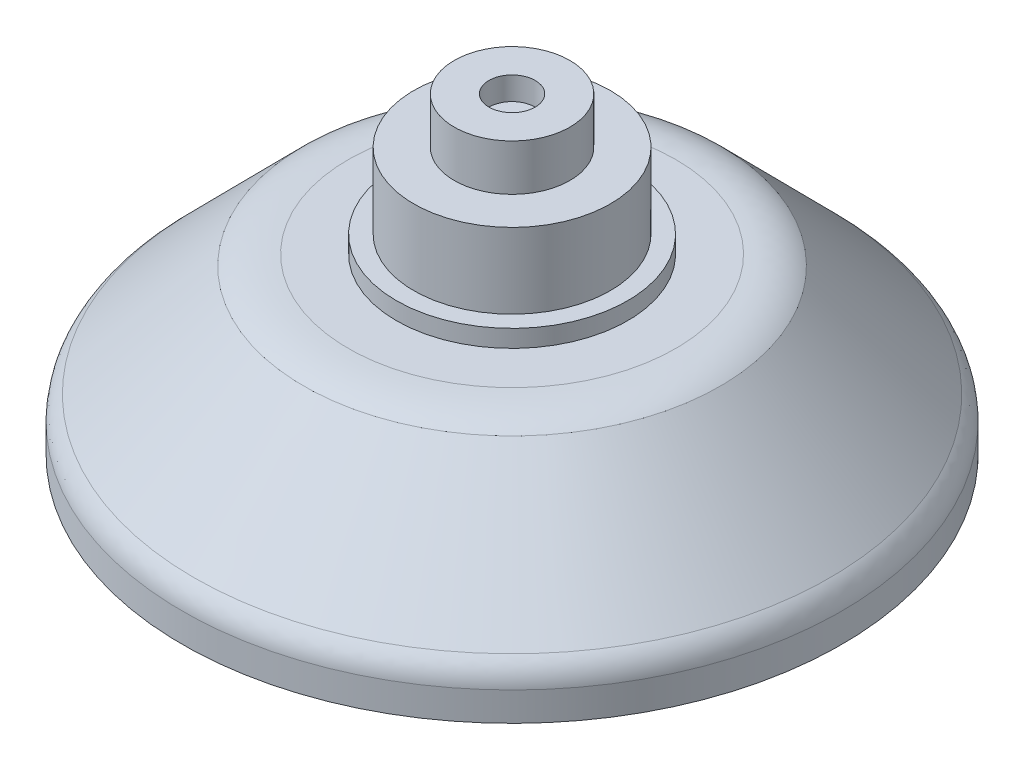
ISO-10303-21;
HEADER;
FILE_DESCRIPTION(('STEP AP214'),'2;1');
FILE_NAME('part.step','',(''),(''),'','','');
FILE_SCHEMA(('AUTOMOTIVE_DESIGN { 1 0 10303 214 1 1 1 1 }'));
ENDSEC;
DATA;
#1=APPLICATION_CONTEXT('core data for automotive mechanical design processes');
#2=APPLICATION_PROTOCOL_DEFINITION('international standard','automotive_design',2000,#1);
#3=PRODUCT_CONTEXT('',#1,'mechanical');
#4=PRODUCT('Part','Part','',(#3));
#5=PRODUCT_RELATED_PRODUCT_CATEGORY('part','',(#4));
#6=PRODUCT_DEFINITION_FORMATION('','',#4);
#7=PRODUCT_DEFINITION_CONTEXT('part definition',#1,'design');
#8=PRODUCT_DEFINITION('design','',#6,#7);
#9=PRODUCT_DEFINITION_SHAPE('','',#8);
#10=(LENGTH_UNIT() NAMED_UNIT(*) SI_UNIT(.MILLI.,.METRE.));
#11=(NAMED_UNIT(*) PLANE_ANGLE_UNIT() SI_UNIT($,.RADIAN.));
#12=(NAMED_UNIT(*) SI_UNIT($,.STERADIAN.) SOLID_ANGLE_UNIT());
#13=UNCERTAINTY_MEASURE_WITH_UNIT(LENGTH_MEASURE(1.E-05),#10,'distance_accuracy_value','');
#14=(GEOMETRIC_REPRESENTATION_CONTEXT(3) GLOBAL_UNCERTAINTY_ASSIGNED_CONTEXT((#13)) GLOBAL_UNIT_ASSIGNED_CONTEXT((#10,
#11,#12)) REPRESENTATION_CONTEXT('',''));
#15=CARTESIAN_POINT('',(0.,0.,0.));
#16=DIRECTION('',(0.,0.,1.));
#17=DIRECTION('',(1.,0.,0.));
#18=AXIS2_PLACEMENT_3D('',#15,#16,#17);
#19=CARTESIAN_POINT('',(0.,24.5,0.));
#20=DIRECTION('',(0.,-1.,0.));
#21=DIRECTION('',(0.,0.,-1.));
#22=AXIS2_PLACEMENT_3D('',#19,#20,#21);
#23=PLANE('',#22);
#24=CARTESIAN_POINT('',(0.,24.5,0.));
#25=DIRECTION('',(0.,1.,0.));
#26=DIRECTION('',(0.,0.,1.));
#27=AXIS2_PLACEMENT_3D('',#24,#25,#26);
#28=CIRCLE('',#27,2.);
#29=CARTESIAN_POINT('',(0.,24.5,2.));
#30=VERTEX_POINT('',#29);
#31=EDGE_CURVE('E110',#30,#30,#28,.T.);
#32=ORIENTED_EDGE('',*,*,#31,.F.);
#33=EDGE_LOOP('',(#32));
#34=FACE_BOUND('',#33,.T.);
#35=CARTESIAN_POINT('',(0.,24.5,0.));
#36=DIRECTION('',(0.,-1.,0.));
#37=DIRECTION('',(0.,0.,-1.));
#38=AXIS2_PLACEMENT_3D('',#35,#36,#37);
#39=CIRCLE('',#38,5.);
#40=CARTESIAN_POINT('',(0.,24.5,-5.));
#41=VERTEX_POINT('',#40);
#42=EDGE_CURVE('E70',#41,#41,#39,.T.);
#43=ORIENTED_EDGE('',*,*,#42,.F.);
#44=EDGE_LOOP('',(#43));
#45=FACE_BOUND('',#44,.T.);
#46=ADVANCED_FACE('F36',(#34,#45),#23,.F.);
#47=CARTESIAN_POINT('',(28.5,0.,0.));
#48=CARTESIAN_POINT('',(28.418819749695,1.21199936278361,0.));
#49=CARTESIAN_POINT('',(27.5,2.0064760729323,0.));
#50=B_SPLINE_CURVE_WITH_KNOTS('',2,(#47,#48,#49),.UNSPECIFIED.,.F.,.F.,(3,3),(0.,1.),.UNSPECIFIED.);
#51=CARTESIAN_POINT('',(0.,0.,0.));
#52=DIRECTION('',(0.,-1.,0.));
#53=AXIS1_PLACEMENT('',#51,#52);
#54=SURFACE_OF_REVOLUTION('',#50,#53);
#55=CARTESIAN_POINT('',(0.,2.0064760729323,0.));
#56=DIRECTION('',(0.,-1.,0.));
#57=DIRECTION('',(0.,0.,-1.));
#58=AXIS2_PLACEMENT_3D('',#55,#56,#57);
#59=CIRCLE('',#58,27.5);
#60=CARTESIAN_POINT('',(0.,2.0064760729323,-27.5));
#61=VERTEX_POINT('',#60);
#62=EDGE_CURVE('E42',#61,#61,#59,.T.);
#63=ORIENTED_EDGE('',*,*,#62,.T.);
#64=EDGE_LOOP('',(#63));
#65=FACE_BOUND('',#64,.T.);
#66=CARTESIAN_POINT('',(0.,0.,0.));
#67=DIRECTION('',(0.,-1.,0.));
#68=DIRECTION('',(0.,0.,-1.));
#69=AXIS2_PLACEMENT_3D('',#66,#67,#68);
#70=CIRCLE('',#69,28.5);
#71=CARTESIAN_POINT('',(0.,0.,-28.5));
#72=VERTEX_POINT('',#71);
#73=EDGE_CURVE('E10',#72,#72,#70,.T.);
#74=ORIENTED_EDGE('',*,*,#73,.F.);
#75=EDGE_LOOP('',(#74));
#76=FACE_BOUND('',#75,.T.);
#77=ADVANCED_FACE('F95',(#65,#76),#54,.F.);
#78=CARTESIAN_POINT('',(0.,2.0064760729323,0.));
#79=DIRECTION('',(0.,-1.,0.));
#80=DIRECTION('',(0.,0.,-1.));
#81=AXIS2_PLACEMENT_3D('',#78,#79,#80);
#82=CONICAL_SURFACE('',#81,27.5,0.780500001094779);
#83=CARTESIAN_POINT('',(0.,11.6,0.));
#84=DIRECTION('',(0.,-1.,0.));
#85=DIRECTION('',(0.,0.,-1.));
#86=AXIS2_PLACEMENT_3D('',#83,#84,#85);
#87=CIRCLE('',#86,18.);
#88=CARTESIAN_POINT('',(0.,11.6,-18.));
#89=VERTEX_POINT('',#88);
#90=EDGE_CURVE('E46',#89,#89,#87,.T.);
#91=ORIENTED_EDGE('',*,*,#90,.T.);
#92=EDGE_LOOP('',(#91));
#93=FACE_BOUND('',#92,.T.);
#94=ORIENTED_EDGE('',*,*,#62,.F.);
#95=EDGE_LOOP('',(#94));
#96=FACE_BOUND('',#95,.T.);
#97=ADVANCED_FACE('F91',(#93,#96),#82,.T.);
#98=CARTESIAN_POINT('',(18.,11.6,0.));
#99=CARTESIAN_POINT('',(16.7976484595864,12.3644088566381,0.));
#100=CARTESIAN_POINT('',(15.5208348303637,12.5,0.));
#101=CARTESIAN_POINT('',(14.1562819076644,12.5,0.));
#102=B_SPLINE_CURVE_WITH_KNOTS('',3,(#98,#99,#100,#101),.UNSPECIFIED.,.F.,.F.,(4,4),(0.,1.),.UNSPECIFIED.);
#103=CARTESIAN_POINT('',(0.,0.,0.));
#104=DIRECTION('',(0.,-1.,0.));
#105=AXIS1_PLACEMENT('',#103,#104);
#106=SURFACE_OF_REVOLUTION('',#102,#105);
#107=CARTESIAN_POINT('',(0.,12.5,0.));
#108=DIRECTION('',(0.,-1.,0.));
#109=DIRECTION('',(0.,0.,-1.));
#110=AXIS2_PLACEMENT_3D('',#107,#108,#109);
#111=CIRCLE('',#110,14.1562819076644);
#112=CARTESIAN_POINT('',(0.,12.5,-14.1562819076644));
#113=VERTEX_POINT('',#112);
#114=EDGE_CURVE('E50',#113,#113,#111,.T.);
#115=ORIENTED_EDGE('',*,*,#114,.T.);
#116=EDGE_LOOP('',(#115));
#117=FACE_BOUND('',#116,.T.);
#118=ORIENTED_EDGE('',*,*,#90,.F.);
#119=EDGE_LOOP('',(#118));
#120=FACE_BOUND('',#119,.T.);
#121=ADVANCED_FACE('F86',(#117,#120),#106,.F.);
#122=CARTESIAN_POINT('',(0.,12.5,0.));
#123=DIRECTION('',(0.,-1.,0.));
#124=DIRECTION('',(0.,0.,-1.));
#125=AXIS2_PLACEMENT_3D('',#122,#123,#124);
#126=PLANE('',#125);
#127=ORIENTED_EDGE('',*,*,#114,.F.);
#128=EDGE_LOOP('',(#127));
#129=FACE_BOUND('',#128,.T.);
#130=CARTESIAN_POINT('',(0.,12.5,0.));
#131=DIRECTION('',(0.,-1.,0.));
#132=DIRECTION('',(0.,0.,-1.));
#133=AXIS2_PLACEMENT_3D('',#130,#131,#132);
#134=CIRCLE('',#133,10.);
#135=CARTESIAN_POINT('',(0.,12.5,-10.));
#136=VERTEX_POINT('',#135);
#137=EDGE_CURVE('E55',#136,#136,#134,.T.);
#138=ORIENTED_EDGE('',*,*,#137,.T.);
#139=EDGE_LOOP('',(#138));
#140=FACE_BOUND('',#139,.T.);
#141=ADVANCED_FACE('F90',(#129,#140),#126,.F.);
#142=CARTESIAN_POINT('',(0.,0.,0.));
#143=DIRECTION('',(0.,-1.,0.));
#144=DIRECTION('',(0.,0.,-1.));
#145=AXIS2_PLACEMENT_3D('',#142,#143,#144);
#146=CYLINDRICAL_SURFACE('',#145,10.);
#147=CARTESIAN_POINT('',(0.,14.,0.));
#148=DIRECTION('',(0.,-1.,0.));
#149=DIRECTION('',(0.,0.,-1.));
#150=AXIS2_PLACEMENT_3D('',#147,#148,#149);
#151=CIRCLE('',#150,10.);
#152=CARTESIAN_POINT('',(0.,14.,-10.));
#153=VERTEX_POINT('',#152);
#154=EDGE_CURVE('E58',#153,#153,#151,.T.);
#155=ORIENTED_EDGE('',*,*,#154,.T.);
#156=EDGE_LOOP('',(#155));
#157=FACE_BOUND('',#156,.T.);
#158=ORIENTED_EDGE('',*,*,#137,.F.);
#159=EDGE_LOOP('',(#158));
#160=FACE_BOUND('',#159,.T.);
#161=ADVANCED_FACE('F135',(#157,#160),#146,.T.);
#162=CARTESIAN_POINT('',(0.,14.,0.));
#163=DIRECTION('',(0.,1.,0.));
#164=DIRECTION('',(0.,0.,1.));
#165=AXIS2_PLACEMENT_3D('',#162,#163,#164);
#166=PLANE('',#165);
#167=CARTESIAN_POINT('',(0.,14.,0.));
#168=DIRECTION('',(0.,-1.,0.));
#169=DIRECTION('',(0.,0.,-1.));
#170=AXIS2_PLACEMENT_3D('',#167,#168,#169);
#171=CIRCLE('',#170,8.5);
#172=CARTESIAN_POINT('',(0.,14.,-8.5));
#173=VERTEX_POINT('',#172);
#174=EDGE_CURVE('E61',#173,#173,#171,.T.);
#175=ORIENTED_EDGE('',*,*,#174,.T.);
#176=EDGE_LOOP('',(#175));
#177=FACE_BOUND('',#176,.T.);
#178=ORIENTED_EDGE('',*,*,#154,.F.);
#179=EDGE_LOOP('',(#178));
#180=FACE_BOUND('',#179,.T.);
#181=ADVANCED_FACE('F129',(#177,#180),#166,.T.);
#182=CARTESIAN_POINT('',(0.,0.,0.));
#183=DIRECTION('',(0.,-1.,0.));
#184=DIRECTION('',(0.,0.,-1.));
#185=AXIS2_PLACEMENT_3D('',#182,#183,#184);
#186=CYLINDRICAL_SURFACE('',#185,8.5);
#187=CARTESIAN_POINT('',(0.,20.5,0.));
#188=DIRECTION('',(0.,-1.,0.));
#189=DIRECTION('',(0.,0.,-1.));
#190=AXIS2_PLACEMENT_3D('',#187,#188,#189);
#191=CIRCLE('',#190,8.5);
#192=CARTESIAN_POINT('',(0.,20.5,-8.5));
#193=VERTEX_POINT('',#192);
#194=EDGE_CURVE('E64',#193,#193,#191,.T.);
#195=ORIENTED_EDGE('',*,*,#194,.T.);
#196=EDGE_LOOP('',(#195));
#197=FACE_BOUND('',#196,.T.);
#198=ORIENTED_EDGE('',*,*,#174,.F.);
#199=EDGE_LOOP('',(#198));
#200=FACE_BOUND('',#199,.T.);
#201=ADVANCED_FACE('F123',(#197,#200),#186,.T.);
#202=CARTESIAN_POINT('',(0.,20.5,0.));
#203=DIRECTION('',(0.,1.,0.));
#204=DIRECTION('',(0.,0.,1.));
#205=AXIS2_PLACEMENT_3D('',#202,#203,#204);
#206=PLANE('',#205);
#207=CARTESIAN_POINT('',(0.,20.5,0.));
#208=DIRECTION('',(0.,-1.,0.));
#209=DIRECTION('',(0.,0.,-1.));
#210=AXIS2_PLACEMENT_3D('',#207,#208,#209);
#211=CIRCLE('',#210,5.);
#212=CARTESIAN_POINT('',(0.,20.5,-5.));
#213=VERTEX_POINT('',#212);
#214=EDGE_CURVE('E67',#213,#213,#211,.T.);
#215=ORIENTED_EDGE('',*,*,#214,.T.);
#216=EDGE_LOOP('',(#215));
#217=FACE_BOUND('',#216,.T.);
#218=ORIENTED_EDGE('',*,*,#194,.F.);
#219=EDGE_LOOP('',(#218));
#220=FACE_BOUND('',#219,.T.);
#221=ADVANCED_FACE('F117',(#217,#220),#206,.T.);
#222=CARTESIAN_POINT('',(0.,0.,0.));
#223=DIRECTION('',(0.,-1.,0.));
#224=DIRECTION('',(0.,0.,-1.));
#225=AXIS2_PLACEMENT_3D('',#222,#223,#224);
#226=CYLINDRICAL_SURFACE('',#225,5.);
#227=ORIENTED_EDGE('',*,*,#42,.T.);
#228=EDGE_LOOP('',(#227));
#229=FACE_BOUND('',#228,.T.);
#230=ORIENTED_EDGE('',*,*,#214,.F.);
#231=EDGE_LOOP('',(#230));
#232=FACE_BOUND('',#231,.T.);
#233=ADVANCED_FACE('F113',(#229,#232),#226,.T.);
#234=CARTESIAN_POINT('',(0.,-2.5,0.));
#235=DIRECTION('',(0.,1.,0.));
#236=DIRECTION('',(0.,0.,1.));
#237=AXIS2_PLACEMENT_3D('',#234,#235,#236);
#238=CYLINDRICAL_SURFACE('',#237,28.5);
#239=CARTESIAN_POINT('',(0.,-2.5,0.));
#240=DIRECTION('',(0.,-1.,0.));
#241=DIRECTION('',(0.,0.,-1.));
#242=AXIS2_PLACEMENT_3D('',#239,#240,#241);
#243=CIRCLE('',#242,28.5);
#244=CARTESIAN_POINT('',(0.,-2.5,-28.5));
#245=VERTEX_POINT('',#244);
#246=EDGE_CURVE('E73',#245,#245,#243,.T.);
#247=ORIENTED_EDGE('',*,*,#246,.F.);
#248=EDGE_LOOP('',(#247));
#249=FACE_BOUND('',#248,.T.);
#250=ORIENTED_EDGE('',*,*,#73,.T.);
#251=EDGE_LOOP('',(#250));
#252=FACE_BOUND('',#251,.T.);
#253=ADVANCED_FACE('F116',(#249,#252),#238,.T.);
#254=CARTESIAN_POINT('',(0.,-2.5,0.));
#255=DIRECTION('',(0.,-1.,0.));
#256=DIRECTION('',(0.,0.,-1.));
#257=AXIS2_PLACEMENT_3D('',#254,#255,#256);
#258=PLANE('',#257);
#259=ORIENTED_EDGE('',*,*,#246,.T.);
#260=EDGE_LOOP('',(#259));
#261=FACE_BOUND('',#260,.T.);
#262=ADVANCED_FACE('F179',(#261),#258,.T.);
#263=CARTESIAN_POINT('',(0.,22.5,0.));
#264=DIRECTION('',(0.,1.,0.));
#265=DIRECTION('',(0.,0.,1.));
#266=AXIS2_PLACEMENT_3D('',#263,#264,#265);
#267=CYLINDRICAL_SURFACE('',#266,2.);
#268=CARTESIAN_POINT('',(0.,22.5,0.));
#269=DIRECTION('',(0.,1.,0.));
#270=DIRECTION('',(0.,0.,1.));
#271=AXIS2_PLACEMENT_3D('',#268,#269,#270);
#272=CIRCLE('',#271,2.);
#273=CARTESIAN_POINT('',(0.,22.5,2.));
#274=VERTEX_POINT('',#273);
#275=EDGE_CURVE('E244',#274,#274,#272,.T.);
#276=ORIENTED_EDGE('',*,*,#275,.F.);
#277=EDGE_LOOP('',(#276));
#278=FACE_BOUND('',#277,.T.);
#279=ORIENTED_EDGE('',*,*,#31,.T.);
#280=EDGE_LOOP('',(#279));
#281=FACE_BOUND('',#280,.T.);
#282=ADVANCED_FACE('F186',(#278,#281),#267,.F.);
#283=CARTESIAN_POINT('',(0.,22.5,0.));
#284=DIRECTION('',(0.,1.,0.));
#285=DIRECTION('',(0.,0.,1.));
#286=AXIS2_PLACEMENT_3D('',#283,#284,#285);
#287=PLANE('',#286);
#288=ORIENTED_EDGE('',*,*,#275,.T.);
#289=EDGE_LOOP('',(#288));
#290=FACE_BOUND('',#289,.T.);
#291=ADVANCED_FACE('F193',(#290),#287,.T.);
#292=CLOSED_SHELL('',(#46,#77,#97,#121,#141,#161,#181,#201,#221,#233,#253,#262,#282,#291));
#293=MANIFOLD_SOLID_BREP('B2',#292);
#294=ADVANCED_BREP_SHAPE_REPRESENTATION('',(#18,#293),#14);
#295=SHAPE_DEFINITION_REPRESENTATION(#9,#294);
ENDSEC;
END-ISO-10303-21;
